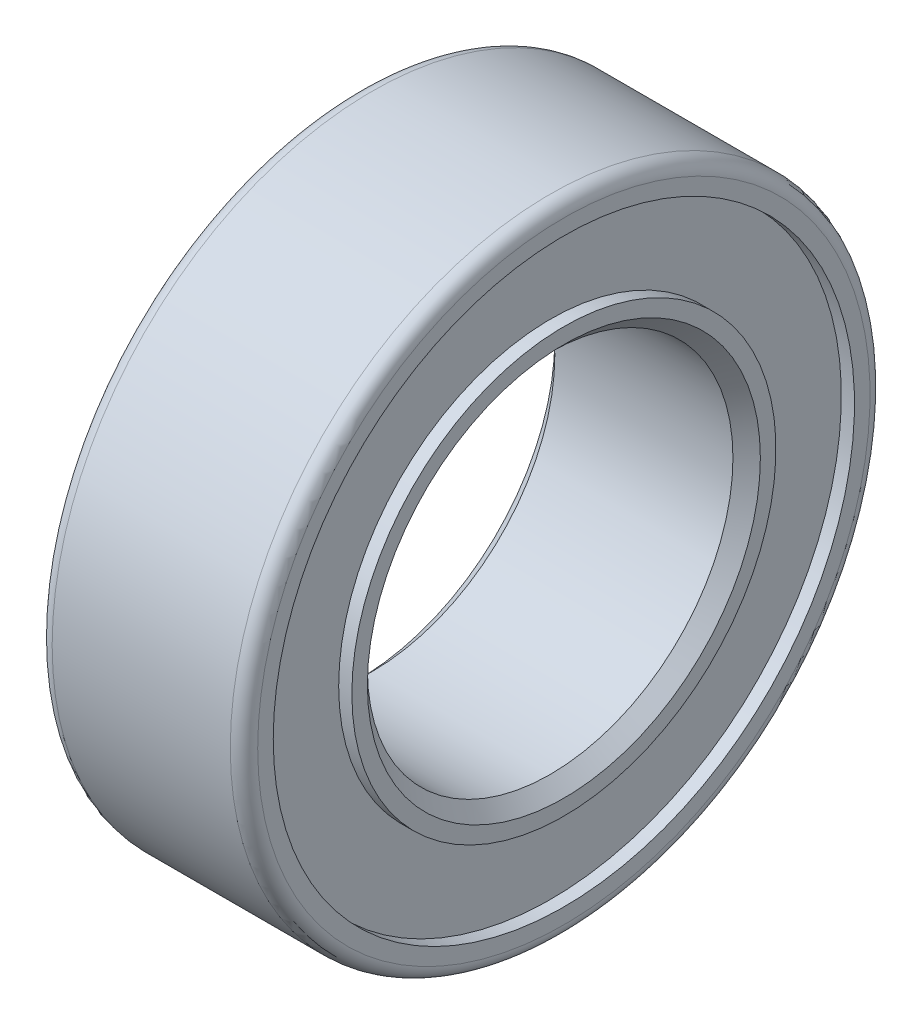
ISO-10303-21;
HEADER;
FILE_DESCRIPTION(('STEP AP214'),'2;1');
FILE_NAME('part.step','',(''),(''),'','','');
FILE_SCHEMA(('AUTOMOTIVE_DESIGN { 1 0 10303 214 1 1 1 1 }'));
ENDSEC;
DATA;
#1=APPLICATION_CONTEXT('core data for automotive mechanical design processes');
#2=APPLICATION_PROTOCOL_DEFINITION('international standard','automotive_design',2000,#1);
#3=PRODUCT_CONTEXT('',#1,'mechanical');
#4=PRODUCT('Part','Part','',(#3));
#5=PRODUCT_RELATED_PRODUCT_CATEGORY('part','',(#4));
#6=PRODUCT_DEFINITION_FORMATION('','',#4);
#7=PRODUCT_DEFINITION_CONTEXT('part definition',#1,'design');
#8=PRODUCT_DEFINITION('design','',#6,#7);
#9=PRODUCT_DEFINITION_SHAPE('','',#8);
#10=(LENGTH_UNIT() NAMED_UNIT(*) SI_UNIT(.MILLI.,.METRE.));
#11=(NAMED_UNIT(*) PLANE_ANGLE_UNIT() SI_UNIT($,.RADIAN.));
#12=(NAMED_UNIT(*) SI_UNIT($,.STERADIAN.) SOLID_ANGLE_UNIT());
#13=UNCERTAINTY_MEASURE_WITH_UNIT(LENGTH_MEASURE(1.E-05),#10,'distance_accuracy_value','');
#14=(GEOMETRIC_REPRESENTATION_CONTEXT(3) GLOBAL_UNCERTAINTY_ASSIGNED_CONTEXT((#13)) GLOBAL_UNIT_ASSIGNED_CONTEXT((#10,
#11,#12)) REPRESENTATION_CONTEXT('',''));
#15=CARTESIAN_POINT('',(0.,0.,0.));
#16=DIRECTION('',(0.,0.,1.));
#17=DIRECTION('',(1.,0.,0.));
#18=AXIS2_PLACEMENT_3D('',#15,#16,#17);
#19=CARTESIAN_POINT('',(3.5702240001001,7.366,0.));
#20=DIRECTION('',(1.,0.,0.));
#21=DIRECTION('',(0.,0.,-1.));
#22=AXIS2_PLACEMENT_3D('',#19,#20,#21);
#23=PLANE('',#22);
#24=CARTESIAN_POINT('',(3.5702240001001,0.,0.));
#25=DIRECTION('',(-1.,0.,0.));
#26=DIRECTION('',(0.,0.,1.));
#27=AXIS2_PLACEMENT_3D('',#24,#25,#26);
#28=CIRCLE('',#27,6.82625000001735);
#29=CARTESIAN_POINT('',(3.5702240001001,0.,6.82625000001735));
#30=VERTEX_POINT('',#29);
#31=EDGE_CURVE('E10',#30,#30,#28,.T.);
#32=ORIENTED_EDGE('',*,*,#31,.T.);
#33=EDGE_LOOP('',(#32));
#34=FACE_BOUND('',#33,.T.);
#35=CARTESIAN_POINT('',(3.5702240001001,0.,0.));
#36=DIRECTION('',(-1.,0.,0.));
#37=DIRECTION('',(0.,0.,1.));
#38=AXIS2_PLACEMENT_3D('',#35,#36,#37);
#39=CIRCLE('',#38,7.366);
#40=CARTESIAN_POINT('',(3.5702240001001,0.,7.366));
#41=VERTEX_POINT('',#40);
#42=EDGE_CURVE('E85',#41,#41,#39,.T.);
#43=ORIENTED_EDGE('',*,*,#42,.F.);
#44=EDGE_LOOP('',(#43));
#45=FACE_BOUND('',#44,.T.);
#46=ADVANCED_FACE('F33',(#34,#45),#23,.T.);
#47=CARTESIAN_POINT('',(3.5702240001001,0.,0.));
#48=DIRECTION('',(1.,0.,0.));
#49=DIRECTION('',(0.,0.,-1.));
#50=AXIS2_PLACEMENT_3D('',#47,#48,#49);
#51=CONICAL_SURFACE('',#50,6.82625000001735,0.785398163397448);
#52=CARTESIAN_POINT('',(3.09397400002354,0.,0.));
#53=DIRECTION('',(-1.,0.,0.));
#54=DIRECTION('',(0.,0.,1.));
#55=AXIS2_PLACEMENT_3D('',#52,#53,#54);
#56=CIRCLE('',#55,6.34999999994079);
#57=CARTESIAN_POINT('',(3.09397400002354,0.,6.34999999994079));
#58=VERTEX_POINT('',#57);
#59=EDGE_CURVE('E39',#58,#58,#56,.T.);
#60=ORIENTED_EDGE('',*,*,#59,.T.);
#61=EDGE_LOOP('',(#60));
#62=FACE_BOUND('',#61,.T.);
#63=ORIENTED_EDGE('',*,*,#31,.F.);
#64=EDGE_LOOP('',(#63));
#65=FACE_BOUND('',#64,.T.);
#66=ADVANCED_FACE('F93',(#62,#65),#51,.F.);
#67=CARTESIAN_POINT('',(3.57147400176893,0.,0.));
#68=DIRECTION('',(-1.,0.,0.));
#69=DIRECTION('',(0.,0.,1.));
#70=AXIS2_PLACEMENT_3D('',#67,#68,#69);
#71=CYLINDRICAL_SURFACE('',#70,6.34999999994079);
#72=CARTESIAN_POINT('',(-3.09397399996669,0.,0.));
#73=DIRECTION('',(-1.,0.,0.));
#74=DIRECTION('',(0.,0.,1.));
#75=AXIS2_PLACEMENT_3D('',#72,#73,#74);
#76=CIRCLE('',#75,6.34999999994079);
#77=CARTESIAN_POINT('',(-3.09397399996669,0.,6.34999999994079));
#78=VERTEX_POINT('',#77);
#79=EDGE_CURVE('E43',#78,#78,#76,.T.);
#80=ORIENTED_EDGE('',*,*,#79,.T.);
#81=EDGE_LOOP('',(#80));
#82=FACE_BOUND('',#81,.T.);
#83=ORIENTED_EDGE('',*,*,#59,.F.);
#84=EDGE_LOOP('',(#83));
#85=FACE_BOUND('',#84,.T.);
#86=ADVANCED_FACE('F97',(#82,#85),#71,.F.);
#87=CARTESIAN_POINT('',(-3.09397399996669,0.,0.));
#88=DIRECTION('',(-1.,0.,0.));
#89=DIRECTION('',(0.,0.,1.));
#90=AXIS2_PLACEMENT_3D('',#87,#88,#89);
#91=CONICAL_SURFACE('',#90,6.34999999994079,0.785398163397448);
#92=CARTESIAN_POINT('',(-3.57022399995799,0.,0.));
#93=DIRECTION('',(-1.,0.,0.));
#94=DIRECTION('',(0.,0.,1.));
#95=AXIS2_PLACEMENT_3D('',#92,#93,#94);
#96=CIRCLE('',#95,6.82624999993209);
#97=CARTESIAN_POINT('',(-3.57022399995799,0.,6.82624999993209));
#98=VERTEX_POINT('',#97);
#99=EDGE_CURVE('E47',#98,#98,#96,.T.);
#100=ORIENTED_EDGE('',*,*,#99,.T.);
#101=EDGE_LOOP('',(#100));
#102=FACE_BOUND('',#101,.T.);
#103=ORIENTED_EDGE('',*,*,#79,.F.);
#104=EDGE_LOOP('',(#103));
#105=FACE_BOUND('',#104,.T.);
#106=ADVANCED_FACE('F101',(#102,#105),#91,.F.);
#107=CARTESIAN_POINT('',(-3.57022399995799,6.82624999993209,0.));
#108=DIRECTION('',(-1.,0.,0.));
#109=DIRECTION('',(0.,0.,1.));
#110=AXIS2_PLACEMENT_3D('',#107,#108,#109);
#111=PLANE('',#110);
#112=CARTESIAN_POINT('',(-3.57022399995799,0.,0.));
#113=DIRECTION('',(-1.,0.,0.));
#114=DIRECTION('',(0.,0.,1.));
#115=AXIS2_PLACEMENT_3D('',#112,#113,#114);
#116=CIRCLE('',#115,7.366);
#117=CARTESIAN_POINT('',(-3.57022399995799,0.,7.366));
#118=VERTEX_POINT('',#117);
#119=EDGE_CURVE('E52',#118,#118,#116,.T.);
#120=ORIENTED_EDGE('',*,*,#119,.T.);
#121=EDGE_LOOP('',(#120));
#122=FACE_BOUND('',#121,.T.);
#123=ORIENTED_EDGE('',*,*,#99,.F.);
#124=EDGE_LOOP('',(#123));
#125=FACE_BOUND('',#124,.T.);
#126=ADVANCED_FACE('F108',(#122,#125),#111,.T.);
#127=CARTESIAN_POINT('',(3.57147400176893,0.,0.));
#128=DIRECTION('',(-1.,0.,0.));
#129=DIRECTION('',(0.,0.,1.));
#130=AXIS2_PLACEMENT_3D('',#127,#128,#129);
#131=CYLINDRICAL_SURFACE('',#130,7.366);
#132=CARTESIAN_POINT('',(-3.1130239998999,0.,0.));
#133=DIRECTION('',(-1.,0.,0.));
#134=DIRECTION('',(0.,0.,1.));
#135=AXIS2_PLACEMENT_3D('',#132,#133,#134);
#136=CIRCLE('',#135,7.366);
#137=CARTESIAN_POINT('',(-3.1130239998999,0.,7.366));
#138=VERTEX_POINT('',#137);
#139=EDGE_CURVE('E55',#138,#138,#136,.T.);
#140=ORIENTED_EDGE('',*,*,#139,.T.);
#141=EDGE_LOOP('',(#140));
#142=FACE_BOUND('',#141,.T.);
#143=ORIENTED_EDGE('',*,*,#119,.F.);
#144=EDGE_LOOP('',(#143));
#145=FACE_BOUND('',#144,.T.);
#146=ADVANCED_FACE('F112',(#142,#145),#131,.T.);
#147=CARTESIAN_POINT('',(-3.1130239998999,7.366,0.));
#148=DIRECTION('',(-1.,0.,0.));
#149=DIRECTION('',(0.,0.,1.));
#150=AXIS2_PLACEMENT_3D('',#147,#148,#149);
#151=PLANE('',#150);
#152=CARTESIAN_POINT('',(-3.1130239998999,0.,0.));
#153=DIRECTION('',(-1.,0.,0.));
#154=DIRECTION('',(0.,0.,1.));
#155=AXIS2_PLACEMENT_3D('',#152,#153,#154);
#156=CIRCLE('',#155,10.0965);
#157=CARTESIAN_POINT('',(-3.1130239998999,0.,10.0965));
#158=VERTEX_POINT('',#157);
#159=EDGE_CURVE('E58',#158,#158,#156,.T.);
#160=ORIENTED_EDGE('',*,*,#159,.T.);
#161=EDGE_LOOP('',(#160));
#162=FACE_BOUND('',#161,.T.);
#163=ORIENTED_EDGE('',*,*,#139,.F.);
#164=EDGE_LOOP('',(#163));
#165=FACE_BOUND('',#164,.T.);
#166=ADVANCED_FACE('F116',(#162,#165),#151,.T.);
#167=CARTESIAN_POINT('',(3.57147400176893,0.,0.));
#168=DIRECTION('',(-1.,0.,0.));
#169=DIRECTION('',(0.,0.,1.));
#170=AXIS2_PLACEMENT_3D('',#167,#168,#169);
#171=CYLINDRICAL_SURFACE('',#170,10.0965);
#172=CARTESIAN_POINT('',(-3.57022399995799,0.,0.));
#173=DIRECTION('',(-1.,0.,0.));
#174=DIRECTION('',(0.,0.,1.));
#175=AXIS2_PLACEMENT_3D('',#172,#173,#174);
#176=CIRCLE('',#175,10.0965);
#177=CARTESIAN_POINT('',(-3.57022399995799,0.,10.0965));
#178=VERTEX_POINT('',#177);
#179=EDGE_CURVE('E61',#178,#178,#176,.T.);
#180=ORIENTED_EDGE('',*,*,#179,.T.);
#181=EDGE_LOOP('',(#180));
#182=FACE_BOUND('',#181,.T.);
#183=ORIENTED_EDGE('',*,*,#159,.F.);
#184=EDGE_LOOP('',(#183));
#185=FACE_BOUND('',#184,.T.);
#186=ADVANCED_FACE('F120',(#182,#185),#171,.F.);
#187=CARTESIAN_POINT('',(-3.57022399995799,10.0965,0.));
#188=DIRECTION('',(-1.,0.,0.));
#189=DIRECTION('',(0.,0.,1.));
#190=AXIS2_PLACEMENT_3D('',#187,#188,#189);
#191=PLANE('',#190);
#192=CARTESIAN_POINT('',(-3.57022399995799,0.,0.));
#193=DIRECTION('',(-1.,0.,0.));
#194=DIRECTION('',(0.,0.,1.));
#195=AXIS2_PLACEMENT_3D('',#192,#193,#194);
#196=CIRCLE('',#195,10.63625);
#197=CARTESIAN_POINT('',(-3.57022399995799,0.,10.63625));
#198=VERTEX_POINT('',#197);
#199=EDGE_CURVE('E64',#198,#198,#196,.T.);
#200=ORIENTED_EDGE('',*,*,#199,.T.);
#201=EDGE_LOOP('',(#200));
#202=FACE_BOUND('',#201,.T.);
#203=ORIENTED_EDGE('',*,*,#179,.F.);
#204=EDGE_LOOP('',(#203));
#205=FACE_BOUND('',#204,.T.);
#206=ADVANCED_FACE('F124',(#202,#205),#191,.T.);
#207=CARTESIAN_POINT('',(-3.09397399995799,0.,0.));
#208=DIRECTION('',(-1.,0.,0.));
#209=DIRECTION('',(0.,0.,1.));
#210=AXIS2_PLACEMENT_3D('',#207,#208,#209);
#211=TOROIDAL_SURFACE('',#210,10.63625,0.476249999999999);
#212=CARTESIAN_POINT('',(-3.09397399995799,0.,0.));
#213=DIRECTION('',(-1.,0.,0.));
#214=DIRECTION('',(0.,0.,1.));
#215=AXIS2_PLACEMENT_3D('',#212,#213,#214);
#216=CIRCLE('',#215,11.1125);
#217=CARTESIAN_POINT('',(-3.09397399995799,0.,11.1125));
#218=VERTEX_POINT('',#217);
#219=EDGE_CURVE('E67',#218,#218,#216,.T.);
#220=ORIENTED_EDGE('',*,*,#219,.T.);
#221=EDGE_LOOP('',(#220));
#222=FACE_BOUND('',#221,.T.);
#223=ORIENTED_EDGE('',*,*,#199,.F.);
#224=EDGE_LOOP('',(#223));
#225=FACE_BOUND('',#224,.T.);
#226=ADVANCED_FACE('F128',(#222,#225),#211,.T.);
#227=CARTESIAN_POINT('',(3.57147400176893,0.,0.));
#228=DIRECTION('',(-1.,0.,0.));
#229=DIRECTION('',(0.,0.,1.));
#230=AXIS2_PLACEMENT_3D('',#227,#228,#229);
#231=CYLINDRICAL_SURFACE('',#230,11.1125);
#232=CARTESIAN_POINT('',(3.0939740001001,0.,0.));
#233=DIRECTION('',(-1.,0.,0.));
#234=DIRECTION('',(0.,0.,1.));
#235=AXIS2_PLACEMENT_3D('',#232,#233,#234);
#236=CIRCLE('',#235,11.1125);
#237=CARTESIAN_POINT('',(3.0939740001001,0.,11.1125));
#238=VERTEX_POINT('',#237);
#239=EDGE_CURVE('E70',#238,#238,#236,.T.);
#240=ORIENTED_EDGE('',*,*,#239,.T.);
#241=EDGE_LOOP('',(#240));
#242=FACE_BOUND('',#241,.T.);
#243=ORIENTED_EDGE('',*,*,#219,.F.);
#244=EDGE_LOOP('',(#243));
#245=FACE_BOUND('',#244,.T.);
#246=ADVANCED_FACE('F132',(#242,#245),#231,.T.);
#247=CARTESIAN_POINT('',(3.0939740001001,0.,0.));
#248=DIRECTION('',(-1.,0.,0.));
#249=DIRECTION('',(0.,0.,1.));
#250=AXIS2_PLACEMENT_3D('',#247,#248,#249);
#251=TOROIDAL_SURFACE('',#250,10.63625,0.476250000000001);
#252=CARTESIAN_POINT('',(3.5702240001001,0.,0.));
#253=DIRECTION('',(-1.,0.,0.));
#254=DIRECTION('',(0.,0.,1.));
#255=AXIS2_PLACEMENT_3D('',#252,#253,#254);
#256=CIRCLE('',#255,10.63625);
#257=CARTESIAN_POINT('',(3.5702240001001,0.,10.63625));
#258=VERTEX_POINT('',#257);
#259=EDGE_CURVE('E73',#258,#258,#256,.T.);
#260=ORIENTED_EDGE('',*,*,#259,.T.);
#261=EDGE_LOOP('',(#260));
#262=FACE_BOUND('',#261,.T.);
#263=ORIENTED_EDGE('',*,*,#239,.F.);
#264=EDGE_LOOP('',(#263));
#265=FACE_BOUND('',#264,.T.);
#266=ADVANCED_FACE('F136',(#262,#265),#251,.T.);
#267=CARTESIAN_POINT('',(3.5702240001001,10.63625,0.));
#268=DIRECTION('',(1.,0.,0.));
#269=DIRECTION('',(0.,0.,-1.));
#270=AXIS2_PLACEMENT_3D('',#267,#268,#269);
#271=PLANE('',#270);
#272=CARTESIAN_POINT('',(3.5702240001001,0.,0.));
#273=DIRECTION('',(-1.,0.,0.));
#274=DIRECTION('',(0.,0.,1.));
#275=AXIS2_PLACEMENT_3D('',#272,#273,#274);
#276=CIRCLE('',#275,10.0965);
#277=CARTESIAN_POINT('',(3.5702240001001,0.,10.0965));
#278=VERTEX_POINT('',#277);
#279=EDGE_CURVE('E76',#278,#278,#276,.T.);
#280=ORIENTED_EDGE('',*,*,#279,.T.);
#281=EDGE_LOOP('',(#280));
#282=FACE_BOUND('',#281,.T.);
#283=ORIENTED_EDGE('',*,*,#259,.F.);
#284=EDGE_LOOP('',(#283));
#285=FACE_BOUND('',#284,.T.);
#286=ADVANCED_FACE('F140',(#282,#285),#271,.T.);
#287=CARTESIAN_POINT('',(3.57147400176893,0.,0.));
#288=DIRECTION('',(-1.,0.,0.));
#289=DIRECTION('',(0.,0.,1.));
#290=AXIS2_PLACEMENT_3D('',#287,#288,#289);
#291=CYLINDRICAL_SURFACE('',#290,10.0965);
#292=CARTESIAN_POINT('',(3.1130240001001,0.,0.));
#293=DIRECTION('',(-1.,0.,0.));
#294=DIRECTION('',(0.,0.,1.));
#295=AXIS2_PLACEMENT_3D('',#292,#293,#294);
#296=CIRCLE('',#295,10.0965);
#297=CARTESIAN_POINT('',(3.1130240001001,0.,10.0965));
#298=VERTEX_POINT('',#297);
#299=EDGE_CURVE('E79',#298,#298,#296,.T.);
#300=ORIENTED_EDGE('',*,*,#299,.T.);
#301=EDGE_LOOP('',(#300));
#302=FACE_BOUND('',#301,.T.);
#303=ORIENTED_EDGE('',*,*,#279,.F.);
#304=EDGE_LOOP('',(#303));
#305=FACE_BOUND('',#304,.T.);
#306=ADVANCED_FACE('F144',(#302,#305),#291,.F.);
#307=CARTESIAN_POINT('',(3.1130240001001,10.0965,0.));
#308=DIRECTION('',(1.,0.,0.));
#309=DIRECTION('',(0.,0.,-1.));
#310=AXIS2_PLACEMENT_3D('',#307,#308,#309);
#311=PLANE('',#310);
#312=CARTESIAN_POINT('',(3.1130240001001,0.,0.));
#313=DIRECTION('',(-1.,0.,0.));
#314=DIRECTION('',(0.,0.,1.));
#315=AXIS2_PLACEMENT_3D('',#312,#313,#314);
#316=CIRCLE('',#315,7.366);
#317=CARTESIAN_POINT('',(3.1130240001001,0.,7.366));
#318=VERTEX_POINT('',#317);
#319=EDGE_CURVE('E82',#318,#318,#316,.T.);
#320=ORIENTED_EDGE('',*,*,#319,.T.);
#321=EDGE_LOOP('',(#320));
#322=FACE_BOUND('',#321,.T.);
#323=ORIENTED_EDGE('',*,*,#299,.F.);
#324=EDGE_LOOP('',(#323));
#325=FACE_BOUND('',#324,.T.);
#326=ADVANCED_FACE('F148',(#322,#325),#311,.T.);
#327=CARTESIAN_POINT('',(3.57147400176893,0.,0.));
#328=DIRECTION('',(-1.,0.,0.));
#329=DIRECTION('',(0.,0.,1.));
#330=AXIS2_PLACEMENT_3D('',#327,#328,#329);
#331=CYLINDRICAL_SURFACE('',#330,7.366);
#332=ORIENTED_EDGE('',*,*,#42,.T.);
#333=EDGE_LOOP('',(#332));
#334=FACE_BOUND('',#333,.T.);
#335=ORIENTED_EDGE('',*,*,#319,.F.);
#336=EDGE_LOOP('',(#335));
#337=FACE_BOUND('',#336,.T.);
#338=ADVANCED_FACE('F89',(#334,#337),#331,.T.);
#339=CLOSED_SHELL('',(#46,#66,#86,#106,#126,#146,#166,#186,#206,#226,#246,#266,#286,#306,#326,#338));
#340=MANIFOLD_SOLID_BREP('B2',#339);
#341=ADVANCED_BREP_SHAPE_REPRESENTATION('',(#18,#340),#14);
#342=SHAPE_DEFINITION_REPRESENTATION(#9,#341);
ENDSEC;
END-ISO-10303-21;
